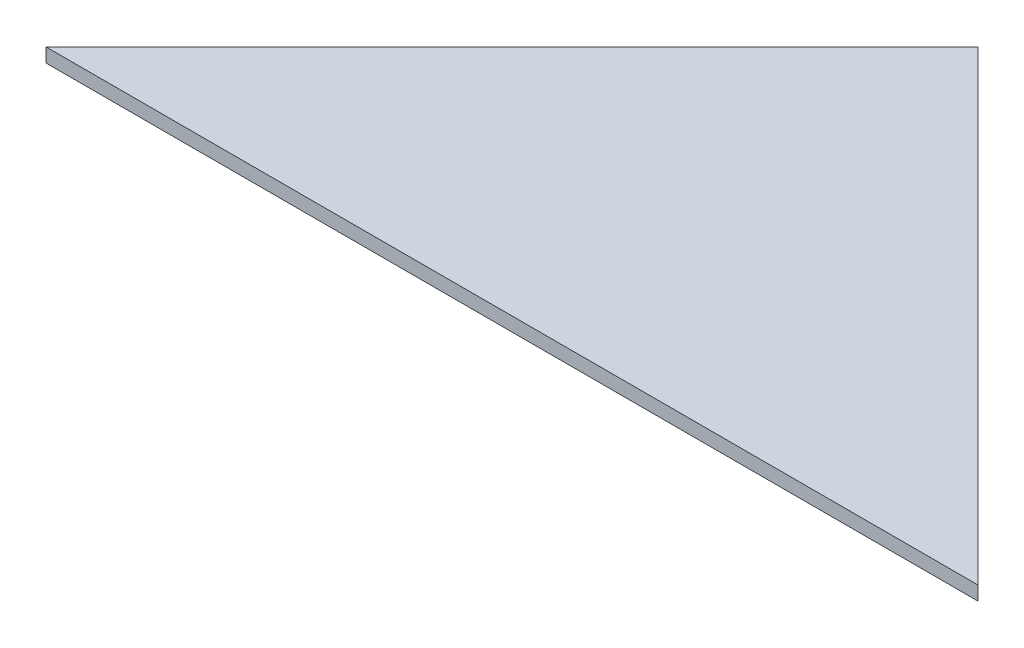
ISO-10303-21;
HEADER;
FILE_DESCRIPTION(('STEP AP214'),'2;1');
FILE_NAME('part.step','',(''),(''),'','','');
FILE_SCHEMA(('AUTOMOTIVE_DESIGN { 1 0 10303 214 1 1 1 1 }'));
ENDSEC;
DATA;
#1=APPLICATION_CONTEXT('core data for automotive mechanical design processes');
#2=APPLICATION_PROTOCOL_DEFINITION('international standard','automotive_design',2000,#1);
#3=PRODUCT_CONTEXT('',#1,'mechanical');
#4=PRODUCT('Part','Part','',(#3));
#5=PRODUCT_RELATED_PRODUCT_CATEGORY('part','',(#4));
#6=PRODUCT_DEFINITION_FORMATION('','',#4);
#7=PRODUCT_DEFINITION_CONTEXT('part definition',#1,'design');
#8=PRODUCT_DEFINITION('design','',#6,#7);
#9=PRODUCT_DEFINITION_SHAPE('','',#8);
#10=(LENGTH_UNIT() NAMED_UNIT(*) SI_UNIT(.MILLI.,.METRE.));
#11=(NAMED_UNIT(*) PLANE_ANGLE_UNIT() SI_UNIT($,.RADIAN.));
#12=(NAMED_UNIT(*) SI_UNIT($,.STERADIAN.) SOLID_ANGLE_UNIT());
#13=UNCERTAINTY_MEASURE_WITH_UNIT(LENGTH_MEASURE(1.E-05),#10,'distance_accuracy_value','');
#14=(GEOMETRIC_REPRESENTATION_CONTEXT(3) GLOBAL_UNCERTAINTY_ASSIGNED_CONTEXT((#13)) GLOBAL_UNIT_ASSIGNED_CONTEXT((#10,
#11,#12)) REPRESENTATION_CONTEXT('',''));
#15=CARTESIAN_POINT('',(0.,0.,0.));
#16=DIRECTION('',(0.,0.,1.));
#17=DIRECTION('',(1.,0.,0.));
#18=AXIS2_PLACEMENT_3D('',#15,#16,#17);
#19=CARTESIAN_POINT('',(50.,1.5,50.));
#20=DIRECTION('',(-0.707106781186548,0.,0.707106781186548));
#21=DIRECTION('',(0.707106781186548,0.,0.707106781186548));
#22=AXIS2_PLACEMENT_3D('',#19,#20,#21);
#23=PLANE('',#22);
#24=DIRECTION('',(-0.707106781186547,0.,-0.707106781186547));
#25=VECTOR('',#24,1.);
#26=CARTESIAN_POINT('',(50.,0.,50.));
#27=LINE('',#26,#25);
#28=CARTESIAN_POINT('',(50.,0.,50.));
#29=VERTEX_POINT('',#28);
#30=CARTESIAN_POINT('',(0.,0.,0.));
#31=VERTEX_POINT('',#30);
#32=EDGE_CURVE('E80',#29,#31,#27,.T.);
#33=ORIENTED_EDGE('',*,*,#32,.T.);
#34=DIRECTION('',(0.,-1.,0.));
#35=VECTOR('',#34,1.);
#36=CARTESIAN_POINT('',(0.,1.5,0.));
#37=LINE('',#36,#35);
#38=CARTESIAN_POINT('',(0.,1.5,0.));
#39=VERTEX_POINT('',#38);
#40=EDGE_CURVE('E11',#39,#31,#37,.T.);
#41=ORIENTED_EDGE('',*,*,#40,.F.);
#42=DIRECTION('',(-0.707106781186547,0.,-0.707106781186547));
#43=VECTOR('',#42,1.);
#44=CARTESIAN_POINT('',(50.,1.5,50.));
#45=LINE('',#44,#43);
#46=CARTESIAN_POINT('',(50.,1.5,50.));
#47=VERTEX_POINT('',#46);
#48=EDGE_CURVE('E73',#47,#39,#45,.T.);
#49=ORIENTED_EDGE('',*,*,#48,.F.);
#50=DIRECTION('',(0.,-1.,0.));
#51=VECTOR('',#50,1.);
#52=CARTESIAN_POINT('',(50.,1.5,50.));
#53=LINE('',#52,#51);
#54=EDGE_CURVE('E81',#47,#29,#53,.T.);
#55=ORIENTED_EDGE('',*,*,#54,.T.);
#56=EDGE_LOOP('',(#33,#41,#49,#55));
#57=FACE_BOUND('',#56,.T.);
#58=ADVANCED_FACE('F33',(#57),#23,.F.);
#59=CARTESIAN_POINT('',(0.,1.5,0.));
#60=DIRECTION('',(0.707106781186548,0.,0.707106781186547));
#61=DIRECTION('',(0.707106781186547,0.,-0.707106781186548));
#62=AXIS2_PLACEMENT_3D('',#59,#60,#61);
#63=PLANE('',#62);
#64=DIRECTION('',(-0.707106781186547,0.,0.707106781186548));
#65=VECTOR('',#64,1.);
#66=CARTESIAN_POINT('',(0.,0.,0.));
#67=LINE('',#66,#65);
#68=CARTESIAN_POINT('',(-50.,0.,50.));
#69=VERTEX_POINT('',#68);
#70=EDGE_CURVE('E61',#31,#69,#67,.T.);
#71=ORIENTED_EDGE('',*,*,#70,.T.);
#72=DIRECTION('',(0.,-1.,0.));
#73=VECTOR('',#72,1.);
#74=CARTESIAN_POINT('',(-50.,1.5,50.));
#75=LINE('',#74,#73);
#76=CARTESIAN_POINT('',(-50.,1.5,50.));
#77=VERTEX_POINT('',#76);
#78=EDGE_CURVE('E41',#77,#69,#75,.T.);
#79=ORIENTED_EDGE('',*,*,#78,.F.);
#80=DIRECTION('',(-0.707106781186547,0.,0.707106781186548));
#81=VECTOR('',#80,1.);
#82=CARTESIAN_POINT('',(0.,1.5,0.));
#83=LINE('',#82,#81);
#84=EDGE_CURVE('E69',#39,#77,#83,.T.);
#85=ORIENTED_EDGE('',*,*,#84,.F.);
#86=ORIENTED_EDGE('',*,*,#40,.T.);
#87=EDGE_LOOP('',(#71,#79,#85,#86));
#88=FACE_BOUND('',#87,.T.);
#89=ADVANCED_FACE('F70',(#88),#63,.F.);
#90=CARTESIAN_POINT('',(-50.,1.5,50.));
#91=DIRECTION('',(0.,0.,-1.));
#92=DIRECTION('',(-1.,0.,0.));
#93=AXIS2_PLACEMENT_3D('',#90,#91,#92);
#94=PLANE('',#93);
#95=DIRECTION('',(1.,0.,0.));
#96=VECTOR('',#95,1.);
#97=CARTESIAN_POINT('',(-50.,0.,50.));
#98=LINE('',#97,#96);
#99=EDGE_CURVE('E66',#69,#29,#98,.T.);
#100=ORIENTED_EDGE('',*,*,#99,.T.);
#101=ORIENTED_EDGE('',*,*,#54,.F.);
#102=DIRECTION('',(1.,0.,0.));
#103=VECTOR('',#102,1.);
#104=CARTESIAN_POINT('',(-50.,1.5,50.));
#105=LINE('',#104,#103);
#106=EDGE_CURVE('E49',#77,#47,#105,.T.);
#107=ORIENTED_EDGE('',*,*,#106,.F.);
#108=ORIENTED_EDGE('',*,*,#78,.T.);
#109=EDGE_LOOP('',(#100,#101,#107,#108));
#110=FACE_BOUND('',#109,.T.);
#111=ADVANCED_FACE('F88',(#110),#94,.F.);
#112=CARTESIAN_POINT('',(0.,1.5,0.));
#113=DIRECTION('',(0.,1.,0.));
#114=DIRECTION('',(0.,0.,1.));
#115=AXIS2_PLACEMENT_3D('',#112,#113,#114);
#116=PLANE('',#115);
#117=ORIENTED_EDGE('',*,*,#48,.T.);
#118=ORIENTED_EDGE('',*,*,#84,.T.);
#119=ORIENTED_EDGE('',*,*,#106,.T.);
#120=EDGE_LOOP('',(#117,#118,#119));
#121=FACE_BOUND('',#120,.T.);
#122=ADVANCED_FACE('F76',(#121),#116,.T.);
#123=CARTESIAN_POINT('',(0.,0.,0.));
#124=DIRECTION('',(0.,1.,0.));
#125=DIRECTION('',(0.,0.,1.));
#126=AXIS2_PLACEMENT_3D('',#123,#124,#125);
#127=PLANE('',#126);
#128=ORIENTED_EDGE('',*,*,#32,.F.);
#129=ORIENTED_EDGE('',*,*,#99,.F.);
#130=ORIENTED_EDGE('',*,*,#70,.F.);
#131=EDGE_LOOP('',(#128,#129,#130));
#132=FACE_BOUND('',#131,.T.);
#133=ADVANCED_FACE('F89',(#132),#127,.F.);
#134=CLOSED_SHELL('',(#58,#89,#111,#122,#133));
#135=MANIFOLD_SOLID_BREP('B2',#134);
#136=ADVANCED_BREP_SHAPE_REPRESENTATION('',(#18,#135),#14);
#137=SHAPE_DEFINITION_REPRESENTATION(#9,#136);
ENDSEC;
END-ISO-10303-21;
